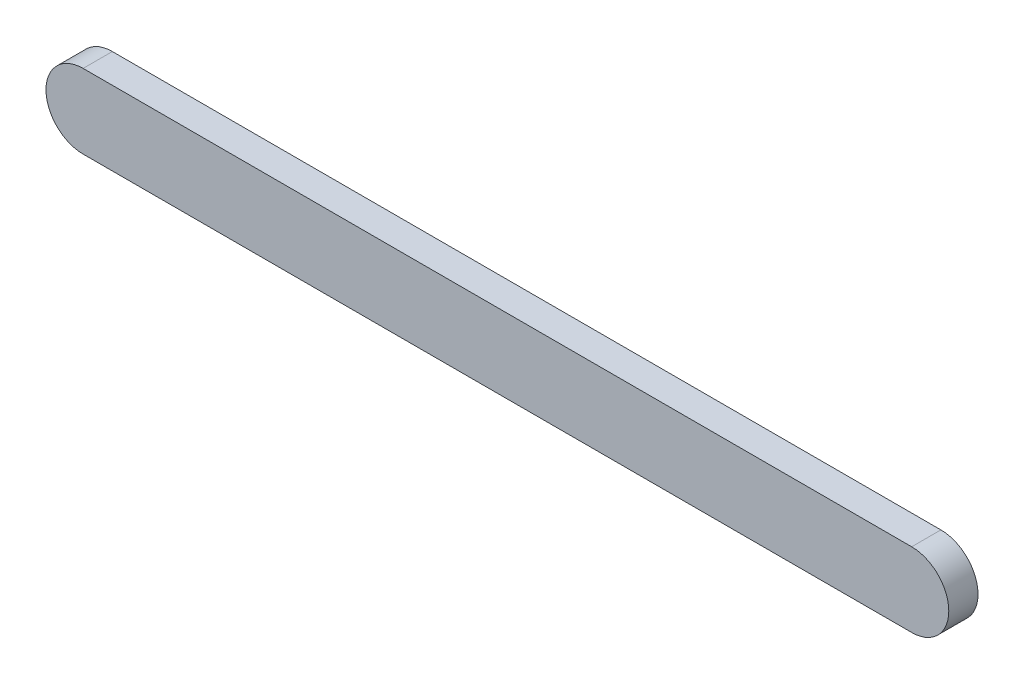
ISO-10303-21;
HEADER;
FILE_DESCRIPTION(('STEP AP214'),'2;1');
FILE_NAME('part.step','',(''),(''),'','','');
FILE_SCHEMA(('AUTOMOTIVE_DESIGN { 1 0 10303 214 1 1 1 1 }'));
ENDSEC;
DATA;
#1=APPLICATION_CONTEXT('core data for automotive mechanical design processes');
#2=APPLICATION_PROTOCOL_DEFINITION('international standard','automotive_design',2000,#1);
#3=PRODUCT_CONTEXT('',#1,'mechanical');
#4=PRODUCT('Part','Part','',(#3));
#5=PRODUCT_RELATED_PRODUCT_CATEGORY('part','',(#4));
#6=PRODUCT_DEFINITION_FORMATION('','',#4);
#7=PRODUCT_DEFINITION_CONTEXT('part definition',#1,'design');
#8=PRODUCT_DEFINITION('design','',#6,#7);
#9=PRODUCT_DEFINITION_SHAPE('','',#8);
#10=(LENGTH_UNIT() NAMED_UNIT(*) SI_UNIT(.MILLI.,.METRE.));
#11=(NAMED_UNIT(*) PLANE_ANGLE_UNIT() SI_UNIT($,.RADIAN.));
#12=(NAMED_UNIT(*) SI_UNIT($,.STERADIAN.) SOLID_ANGLE_UNIT());
#13=UNCERTAINTY_MEASURE_WITH_UNIT(LENGTH_MEASURE(1.E-05),#10,'distance_accuracy_value','');
#14=(GEOMETRIC_REPRESENTATION_CONTEXT(3) GLOBAL_UNCERTAINTY_ASSIGNED_CONTEXT((#13)) GLOBAL_UNIT_ASSIGNED_CONTEXT((#10,
#11,#12)) REPRESENTATION_CONTEXT('',''));
#15=CARTESIAN_POINT('',(0.,0.,0.));
#16=DIRECTION('',(0.,0.,1.));
#17=DIRECTION('',(1.,0.,0.));
#18=AXIS2_PLACEMENT_3D('',#15,#16,#17);
#19=CARTESIAN_POINT('',(130.048,61.3220008,0.));
#20=DIRECTION('',(0.,1.,0.));
#21=DIRECTION('',(1.,0.,0.));
#22=AXIS2_PLACEMENT_3D('',#19,#20,#21);
#23=PLANE('',#22);
#24=DIRECTION('',(1.,0.,0.));
#25=VECTOR('',#24,1.);
#26=CARTESIAN_POINT('',(130.048,61.3220008,0.1999996));
#27=LINE('',#26,#25);
#28=CARTESIAN_POINT('',(130.048,61.3220008,0.1999996));
#29=VERTEX_POINT('',#28);
#30=CARTESIAN_POINT('',(135.7186008,61.3220008,0.1999996));
#31=VERTEX_POINT('',#30);
#32=EDGE_CURVE('E11',#29,#31,#27,.T.);
#33=ORIENTED_EDGE('',*,*,#32,.F.);
#34=DIRECTION('',(0.,0.,1.));
#35=VECTOR('',#34,1.);
#36=CARTESIAN_POINT('',(130.048,61.3220008,0.));
#37=LINE('',#36,#35);
#38=CARTESIAN_POINT('',(130.048,61.3220008,0.));
#39=VERTEX_POINT('',#38);
#40=EDGE_CURVE('E24',#39,#29,#37,.T.);
#41=ORIENTED_EDGE('',*,*,#40,.F.);
#42=DIRECTION('',(1.,0.,0.));
#43=VECTOR('',#42,1.);
#44=CARTESIAN_POINT('',(130.048,61.3220008,0.));
#45=LINE('',#44,#43);
#46=CARTESIAN_POINT('',(135.7186008,61.3220008,0.));
#47=VERTEX_POINT('',#46);
#48=EDGE_CURVE('E75',#39,#47,#45,.T.);
#49=ORIENTED_EDGE('',*,*,#48,.T.);
#50=DIRECTION('',(0.,0.,1.));
#51=VECTOR('',#50,1.);
#52=CARTESIAN_POINT('',(135.7186008,61.3220008,0.));
#53=LINE('',#52,#51);
#54=EDGE_CURVE('E37',#47,#31,#53,.T.);
#55=ORIENTED_EDGE('',*,*,#54,.T.);
#56=EDGE_LOOP('',(#33,#41,#49,#55));
#57=FACE_BOUND('',#56,.T.);
#58=ADVANCED_FACE('F17',(#57),#23,.F.);
#59=CARTESIAN_POINT('',(135.7186008,61.5760008,0.));
#60=DIRECTION('',(0.,0.,-1.));
#61=DIRECTION('',(0.,-1.,0.));
#62=AXIS2_PLACEMENT_3D('',#59,#60,#61);
#63=CYLINDRICAL_SURFACE('',#62,0.253999999999995);
#64=CARTESIAN_POINT('',(135.7186008,61.5760008,0.1999996));
#65=DIRECTION('',(0.,0.,1.));
#66=DIRECTION('',(0.,-1.,0.));
#67=AXIS2_PLACEMENT_3D('',#64,#65,#66);
#68=CIRCLE('',#67,0.253999999999995);
#69=CARTESIAN_POINT('',(135.7186008,61.8300008,0.1999996));
#70=VERTEX_POINT('',#69);
#71=EDGE_CURVE('E83',#31,#70,#68,.T.);
#72=ORIENTED_EDGE('',*,*,#71,.F.);
#73=ORIENTED_EDGE('',*,*,#54,.F.);
#74=CARTESIAN_POINT('',(135.7186008,61.5760008,0.));
#75=DIRECTION('',(0.,0.,1.));
#76=DIRECTION('',(0.,-1.,0.));
#77=AXIS2_PLACEMENT_3D('',#74,#75,#76);
#78=CIRCLE('',#77,0.253999999999995);
#79=CARTESIAN_POINT('',(135.7186008,61.8300008,0.));
#80=VERTEX_POINT('',#79);
#81=EDGE_CURVE('E81',#47,#80,#78,.T.);
#82=ORIENTED_EDGE('',*,*,#81,.T.);
#83=DIRECTION('',(0.,0.,1.));
#84=VECTOR('',#83,1.);
#85=CARTESIAN_POINT('',(135.7186008,61.8300008,0.));
#86=LINE('',#85,#84);
#87=EDGE_CURVE('E67',#80,#70,#86,.T.);
#88=ORIENTED_EDGE('',*,*,#87,.T.);
#89=EDGE_LOOP('',(#72,#73,#82,#88));
#90=FACE_BOUND('',#89,.T.);
#91=ADVANCED_FACE('F89',(#90),#63,.T.);
#92=CARTESIAN_POINT('',(135.7186008,61.8300008,0.));
#93=DIRECTION('',(0.,-1.,0.));
#94=DIRECTION('',(-1.,0.,0.));
#95=AXIS2_PLACEMENT_3D('',#92,#93,#94);
#96=PLANE('',#95);
#97=DIRECTION('',(-1.,0.,0.));
#98=VECTOR('',#97,1.);
#99=CARTESIAN_POINT('',(135.7186008,61.8300008,0.1999996));
#100=LINE('',#99,#98);
#101=CARTESIAN_POINT('',(130.048,61.8300008,0.1999996));
#102=VERTEX_POINT('',#101);
#103=EDGE_CURVE('E71',#70,#102,#100,.T.);
#104=ORIENTED_EDGE('',*,*,#103,.F.);
#105=ORIENTED_EDGE('',*,*,#87,.F.);
#106=DIRECTION('',(-1.,0.,0.));
#107=VECTOR('',#106,1.);
#108=CARTESIAN_POINT('',(135.7186008,61.8300008,0.));
#109=LINE('',#108,#107);
#110=CARTESIAN_POINT('',(130.048,61.8300008,0.));
#111=VERTEX_POINT('',#110);
#112=EDGE_CURVE('E63',#80,#111,#109,.T.);
#113=ORIENTED_EDGE('',*,*,#112,.T.);
#114=DIRECTION('',(0.,0.,1.));
#115=VECTOR('',#114,1.);
#116=CARTESIAN_POINT('',(130.048,61.8300008,0.));
#117=LINE('',#116,#115);
#118=EDGE_CURVE('E53',#111,#102,#117,.T.);
#119=ORIENTED_EDGE('',*,*,#118,.T.);
#120=EDGE_LOOP('',(#104,#105,#113,#119));
#121=FACE_BOUND('',#120,.T.);
#122=ADVANCED_FACE('F66',(#121),#96,.F.);
#123=CARTESIAN_POINT('',(130.048,61.5760008,0.));
#124=DIRECTION('',(0.,0.,-1.));
#125=DIRECTION('',(0.,1.,0.));
#126=AXIS2_PLACEMENT_3D('',#123,#124,#125);
#127=CYLINDRICAL_SURFACE('',#126,0.253999999999995);
#128=CARTESIAN_POINT('',(130.048,61.5760008,0.1999996));
#129=DIRECTION('',(0.,0.,1.));
#130=DIRECTION('',(0.,1.,0.));
#131=AXIS2_PLACEMENT_3D('',#128,#129,#130);
#132=CIRCLE('',#131,0.253999999999995);
#133=EDGE_CURVE('E59',#102,#29,#132,.T.);
#134=ORIENTED_EDGE('',*,*,#133,.F.);
#135=ORIENTED_EDGE('',*,*,#118,.F.);
#136=CARTESIAN_POINT('',(130.048,61.5760008,0.));
#137=DIRECTION('',(0.,0.,1.));
#138=DIRECTION('',(0.,1.,0.));
#139=AXIS2_PLACEMENT_3D('',#136,#137,#138);
#140=CIRCLE('',#139,0.253999999999995);
#141=EDGE_CURVE('E57',#111,#39,#140,.T.);
#142=ORIENTED_EDGE('',*,*,#141,.T.);
#143=ORIENTED_EDGE('',*,*,#40,.T.);
#144=EDGE_LOOP('',(#134,#135,#142,#143));
#145=FACE_BOUND('',#144,.T.);
#146=ADVANCED_FACE('F55',(#145),#127,.T.);
#147=CARTESIAN_POINT('',(130.048,61.3220008,0.));
#148=DIRECTION('',(0.,0.,-1.));
#149=DIRECTION('',(-1.,0.,0.));
#150=AXIS2_PLACEMENT_3D('',#147,#148,#149);
#151=PLANE('',#150);
#152=ORIENTED_EDGE('',*,*,#141,.F.);
#153=ORIENTED_EDGE('',*,*,#112,.F.);
#154=ORIENTED_EDGE('',*,*,#81,.F.);
#155=ORIENTED_EDGE('',*,*,#48,.F.);
#156=EDGE_LOOP('',(#152,#153,#154,#155));
#157=FACE_BOUND('',#156,.T.);
#158=ADVANCED_FACE('F74',(#157),#151,.T.);
#159=CARTESIAN_POINT('',(130.048,61.3220008,0.1999996));
#160=DIRECTION('',(0.,0.,-1.));
#161=DIRECTION('',(-1.,0.,0.));
#162=AXIS2_PLACEMENT_3D('',#159,#160,#161);
#163=PLANE('',#162);
#164=ORIENTED_EDGE('',*,*,#32,.T.);
#165=ORIENTED_EDGE('',*,*,#71,.T.);
#166=ORIENTED_EDGE('',*,*,#103,.T.);
#167=ORIENTED_EDGE('',*,*,#133,.T.);
#168=EDGE_LOOP('',(#164,#165,#166,#167));
#169=FACE_BOUND('',#168,.T.);
#170=ADVANCED_FACE('F91',(#169),#163,.F.);
#171=CLOSED_SHELL('',(#58,#91,#122,#146,#158,#170));
#172=MANIFOLD_SOLID_BREP('B1',#171);
#173=ADVANCED_BREP_SHAPE_REPRESENTATION('',(#18,#172),#14);
#174=SHAPE_DEFINITION_REPRESENTATION(#9,#173);
ENDSEC;
END-ISO-10303-21;
